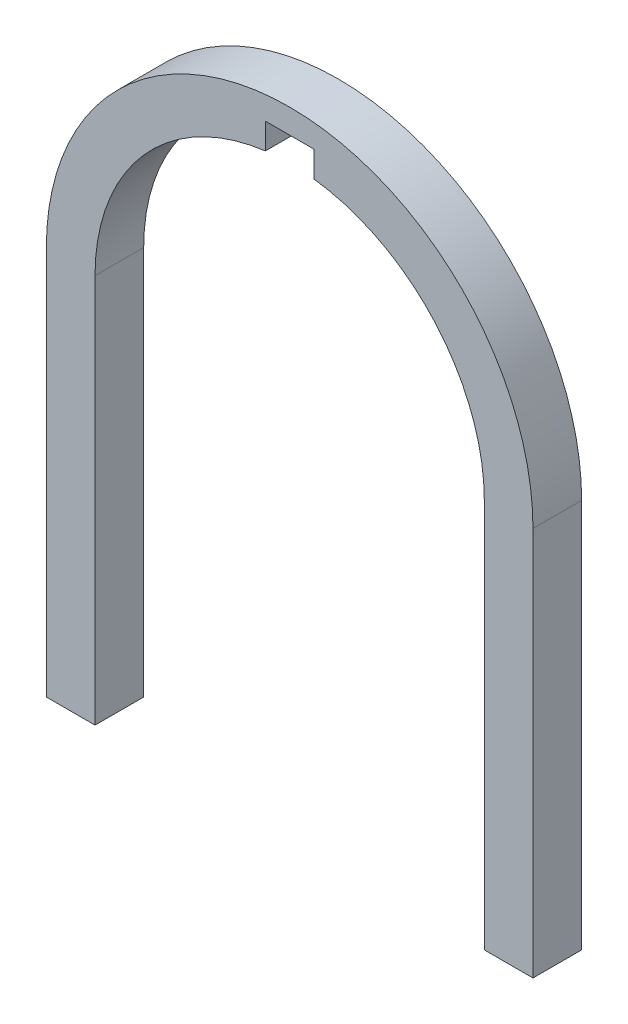
ISO-10303-21;
HEADER;
FILE_DESCRIPTION(('STEP AP214'),'2;1');
FILE_NAME('part.step','',(''),(''),'','','');
FILE_SCHEMA(('AUTOMOTIVE_DESIGN { 1 0 10303 214 1 1 1 1 }'));
ENDSEC;
DATA;
#1=APPLICATION_CONTEXT('core data for automotive mechanical design processes');
#2=APPLICATION_PROTOCOL_DEFINITION('international standard','automotive_design',2000,#1);
#3=PRODUCT_CONTEXT('',#1,'mechanical');
#4=PRODUCT('Part','Part','',(#3));
#5=PRODUCT_RELATED_PRODUCT_CATEGORY('part','',(#4));
#6=PRODUCT_DEFINITION_FORMATION('','',#4);
#7=PRODUCT_DEFINITION_CONTEXT('part definition',#1,'design');
#8=PRODUCT_DEFINITION('design','',#6,#7);
#9=PRODUCT_DEFINITION_SHAPE('','',#8);
#10=(LENGTH_UNIT() NAMED_UNIT(*) SI_UNIT(.MILLI.,.METRE.));
#11=(NAMED_UNIT(*) PLANE_ANGLE_UNIT() SI_UNIT($,.RADIAN.));
#12=(NAMED_UNIT(*) SI_UNIT($,.STERADIAN.) SOLID_ANGLE_UNIT());
#13=UNCERTAINTY_MEASURE_WITH_UNIT(LENGTH_MEASURE(1.E-05),#10,'distance_accuracy_value','');
#14=(GEOMETRIC_REPRESENTATION_CONTEXT(3) GLOBAL_UNCERTAINTY_ASSIGNED_CONTEXT((#13)) GLOBAL_UNIT_ASSIGNED_CONTEXT((#10,
#11,#12)) REPRESENTATION_CONTEXT('',''));
#15=CARTESIAN_POINT('',(0.,0.,0.));
#16=DIRECTION('',(0.,0.,1.));
#17=DIRECTION('',(1.,0.,0.));
#18=AXIS2_PLACEMENT_3D('',#15,#16,#17);
#19=CARTESIAN_POINT('',(-32.3663982008304,3.9707067424354,-4.65402003222828));
#20=DIRECTION('',(0.,0.,-1.));
#21=DIRECTION('',(-1.,0.,0.));
#22=AXIS2_PLACEMENT_3D('',#19,#20,#21);
#23=CYLINDRICAL_SURFACE('',#22,20.);
#24=CARTESIAN_POINT('',(-32.3663982008304,3.9707067424354,-9.65402003222828));
#25=DIRECTION('',(0.,0.,-1.));
#26=DIRECTION('',(-1.,0.,0.));
#27=AXIS2_PLACEMENT_3D('',#24,#25,#26);
#28=CIRCLE('',#27,20.);
#29=CARTESIAN_POINT('',(-52.3663982008304,3.9707067424354,-9.65402003222828));
#30=VERTEX_POINT('',#29);
#31=CARTESIAN_POINT('',(-34.8663982008304,23.8138415754198,-9.65402003222828));
#32=VERTEX_POINT('',#31);
#33=EDGE_CURVE('E149',#30,#32,#28,.T.);
#34=ORIENTED_EDGE('',*,*,#33,.T.);
#35=DIRECTION('',(0.,0.,-1.));
#36=VECTOR('',#35,1.);
#37=CARTESIAN_POINT('',(-34.8663982008304,23.8138415754198,-4.65402003222828));
#38=LINE('',#37,#36);
#39=CARTESIAN_POINT('',(-34.8663982008304,23.8138415754198,-4.65402003222828));
#40=VERTEX_POINT('',#39);
#41=EDGE_CURVE('E146',#32,#40,#38,.F.);
#42=ORIENTED_EDGE('',*,*,#41,.T.);
#43=CARTESIAN_POINT('',(-32.3663982008304,3.9707067424354,-4.65402003222828));
#44=DIRECTION('',(0.,0.,-1.));
#45=DIRECTION('',(-1.,0.,0.));
#46=AXIS2_PLACEMENT_3D('',#43,#44,#45);
#47=CIRCLE('',#46,20.);
#48=CARTESIAN_POINT('',(-52.3663982008304,3.9707067424354,-4.65402003222828));
#49=VERTEX_POINT('',#48);
#50=EDGE_CURVE('E230',#49,#40,#47,.T.);
#51=ORIENTED_EDGE('',*,*,#50,.F.);
#52=DIRECTION('',(0.,0.,-1.));
#53=VECTOR('',#52,1.);
#54=CARTESIAN_POINT('',(-52.3663982008304,3.9707067424354,-4.65402003222828));
#55=LINE('',#54,#53);
#56=EDGE_CURVE('E170',#49,#30,#55,.T.);
#57=ORIENTED_EDGE('',*,*,#56,.T.);
#58=EDGE_LOOP('',(#34,#42,#51,#57));
#59=FACE_BOUND('',#58,.T.);
#60=ADVANCED_FACE('F32',(#59),#23,.F.);
#61=CARTESIAN_POINT('',(-52.3663982008304,-36.0292932575646,-4.65402003222828));
#62=DIRECTION('',(0.,1.,0.));
#63=DIRECTION('',(-1.,0.,0.));
#64=AXIS2_PLACEMENT_3D('',#61,#62,#63);
#65=PLANE('',#64);
#66=DIRECTION('',(1.,0.,0.));
#67=VECTOR('',#66,1.);
#68=CARTESIAN_POINT('',(-52.3663982008304,-36.0292932575646,-9.65402003222828));
#69=LINE('',#68,#67);
#70=CARTESIAN_POINT('',(-57.3663982008304,-36.0292932575646,-9.65402003222828));
#71=VERTEX_POINT('',#70);
#72=CARTESIAN_POINT('',(-52.3663982008304,-36.0292932575646,-9.65402003222828));
#73=VERTEX_POINT('',#72);
#74=EDGE_CURVE('E142',#71,#73,#69,.T.);
#75=ORIENTED_EDGE('',*,*,#74,.T.);
#76=DIRECTION('',(0.,0.,-1.));
#77=VECTOR('',#76,1.);
#78=CARTESIAN_POINT('',(-52.3663982008304,-36.0292932575646,-4.65402003222828));
#79=LINE('',#78,#77);
#80=CARTESIAN_POINT('',(-52.3663982008304,-36.0292932575646,-4.65402003222828));
#81=VERTEX_POINT('',#80);
#82=EDGE_CURVE('E40',#81,#73,#79,.T.);
#83=ORIENTED_EDGE('',*,*,#82,.F.);
#84=DIRECTION('',(1.,0.,0.));
#85=VECTOR('',#84,1.);
#86=CARTESIAN_POINT('',(-52.3663982008304,-36.0292932575646,-4.65402003222828));
#87=LINE('',#86,#85);
#88=CARTESIAN_POINT('',(-57.3663982008304,-36.0292932575646,-4.65402003222828));
#89=VERTEX_POINT('',#88);
#90=EDGE_CURVE('E160',#89,#81,#87,.T.);
#91=ORIENTED_EDGE('',*,*,#90,.F.);
#92=DIRECTION('',(0.,0.,-1.));
#93=VECTOR('',#92,1.);
#94=CARTESIAN_POINT('',(-57.3663982008304,-36.0292932575646,-4.65402003222828));
#95=LINE('',#94,#93);
#96=EDGE_CURVE('E138',#89,#71,#95,.T.);
#97=ORIENTED_EDGE('',*,*,#96,.T.);
#98=EDGE_LOOP('',(#75,#83,#91,#97));
#99=FACE_BOUND('',#98,.T.);
#100=ADVANCED_FACE('F34',(#99),#65,.F.);
#101=CARTESIAN_POINT('',(-52.3663982008304,-36.0292932575646,-4.65402003222828));
#102=DIRECTION('',(-1.,0.,0.));
#103=DIRECTION('',(0.,-1.,0.));
#104=AXIS2_PLACEMENT_3D('',#101,#102,#103);
#105=PLANE('',#104);
#106=DIRECTION('',(0.,1.,0.));
#107=VECTOR('',#106,1.);
#108=CARTESIAN_POINT('',(-52.3663982008304,-36.0292932575646,-9.65402003222828));
#109=LINE('',#108,#107);
#110=EDGE_CURVE('E145',#73,#30,#109,.T.);
#111=ORIENTED_EDGE('',*,*,#110,.T.);
#112=ORIENTED_EDGE('',*,*,#56,.F.);
#113=DIRECTION('',(0.,1.,0.));
#114=VECTOR('',#113,1.);
#115=CARTESIAN_POINT('',(-52.3663982008304,-36.0292932575646,-4.65402003222828));
#116=LINE('',#115,#114);
#117=EDGE_CURVE('E98',#81,#49,#116,.T.);
#118=ORIENTED_EDGE('',*,*,#117,.F.);
#119=ORIENTED_EDGE('',*,*,#82,.T.);
#120=EDGE_LOOP('',(#111,#112,#118,#119));
#121=FACE_BOUND('',#120,.T.);
#122=ADVANCED_FACE('F173',(#121),#105,.F.);
#123=CARTESIAN_POINT('',(-29.8663982008304,23.8138415754198,-4.65402003222828));
#124=VERTEX_POINT('',#123);
#125=CARTESIAN_POINT('',(-12.3663982008304,3.9707067424354,-4.65402003222828));
#126=VERTEX_POINT('',#125);
#127=EDGE_CURVE('E229',#124,#126,#47,.T.);
#128=ORIENTED_EDGE('',*,*,#127,.F.);
#129=DIRECTION('',(0.,0.,-1.));
#130=VECTOR('',#129,1.);
#131=CARTESIAN_POINT('',(-29.8663982008304,23.8138415754198,-4.65402003222828));
#132=LINE('',#131,#130);
#133=CARTESIAN_POINT('',(-29.8663982008304,23.8138415754198,-9.65402003222828));
#134=VERTEX_POINT('',#133);
#135=EDGE_CURVE('E211',#124,#134,#132,.T.);
#136=ORIENTED_EDGE('',*,*,#135,.T.);
#137=CARTESIAN_POINT('',(-12.3663982008304,3.9707067424354,-9.65402003222828));
#138=VERTEX_POINT('',#137);
#139=EDGE_CURVE('E148',#134,#138,#28,.T.);
#140=ORIENTED_EDGE('',*,*,#139,.T.);
#141=DIRECTION('',(0.,0.,-1.));
#142=VECTOR('',#141,1.);
#143=CARTESIAN_POINT('',(-12.3663982008304,3.9707067424354,-4.65402003222828));
#144=LINE('',#143,#142);
#145=EDGE_CURVE('E167',#126,#138,#144,.T.);
#146=ORIENTED_EDGE('',*,*,#145,.F.);
#147=EDGE_LOOP('',(#128,#136,#140,#146));
#148=FACE_BOUND('',#147,.T.);
#149=ADVANCED_FACE('F247',(#148),#23,.F.);
#150=CARTESIAN_POINT('',(-12.3663982008304,3.9707067424354,-4.65402003222828));
#151=DIRECTION('',(1.,0.,0.));
#152=DIRECTION('',(0.,1.,0.));
#153=AXIS2_PLACEMENT_3D('',#150,#151,#152);
#154=PLANE('',#153);
#155=DIRECTION('',(0.,-1.,0.));
#156=VECTOR('',#155,1.);
#157=CARTESIAN_POINT('',(-12.3663982008304,3.9707067424354,-9.65402003222828));
#158=LINE('',#157,#156);
#159=CARTESIAN_POINT('',(-12.3663982008304,-36.0292932575646,-9.65402003222828));
#160=VERTEX_POINT('',#159);
#161=EDGE_CURVE('E152',#138,#160,#158,.T.);
#162=ORIENTED_EDGE('',*,*,#161,.T.);
#163=DIRECTION('',(0.,0.,-1.));
#164=VECTOR('',#163,1.);
#165=CARTESIAN_POINT('',(-12.3663982008304,-36.0292932575646,-4.65402003222828));
#166=LINE('',#165,#164);
#167=CARTESIAN_POINT('',(-12.3663982008304,-36.0292932575646,-4.65402003222828));
#168=VERTEX_POINT('',#167);
#169=EDGE_CURVE('E164',#168,#160,#166,.T.);
#170=ORIENTED_EDGE('',*,*,#169,.F.);
#171=DIRECTION('',(0.,-1.,0.));
#172=VECTOR('',#171,1.);
#173=CARTESIAN_POINT('',(-12.3663982008304,3.9707067424354,-4.65402003222828));
#174=LINE('',#173,#172);
#175=EDGE_CURVE('E232',#126,#168,#174,.T.);
#176=ORIENTED_EDGE('',*,*,#175,.F.);
#177=ORIENTED_EDGE('',*,*,#145,.T.);
#178=EDGE_LOOP('',(#162,#170,#176,#177));
#179=FACE_BOUND('',#178,.T.);
#180=ADVANCED_FACE('F239',(#179),#154,.F.);
#181=CARTESIAN_POINT('',(-12.3663982008304,-36.0292932575646,-4.65402003222828));
#182=DIRECTION('',(0.,1.,0.));
#183=DIRECTION('',(-1.,0.,0.));
#184=AXIS2_PLACEMENT_3D('',#181,#182,#183);
#185=PLANE('',#184);
#186=DIRECTION('',(1.,0.,0.));
#187=VECTOR('',#186,1.);
#188=CARTESIAN_POINT('',(-12.3663982008304,-36.0292932575646,-9.65402003222828));
#189=LINE('',#188,#187);
#190=CARTESIAN_POINT('',(-7.36639820083039,-36.0292932575646,-9.65402003222828));
#191=VERTEX_POINT('',#190);
#192=EDGE_CURVE('E154',#160,#191,#189,.T.);
#193=ORIENTED_EDGE('',*,*,#192,.T.);
#194=DIRECTION('',(0.,0.,-1.));
#195=VECTOR('',#194,1.);
#196=CARTESIAN_POINT('',(-7.36639820083039,-36.0292932575646,-4.65402003222828));
#197=LINE('',#196,#195);
#198=CARTESIAN_POINT('',(-7.36639820083039,-36.0292932575646,-4.65402003222828));
#199=VERTEX_POINT('',#198);
#200=EDGE_CURVE('E133',#199,#191,#197,.T.);
#201=ORIENTED_EDGE('',*,*,#200,.F.);
#202=DIRECTION('',(1.,0.,0.));
#203=VECTOR('',#202,1.);
#204=CARTESIAN_POINT('',(-12.3663982008304,-36.0292932575646,-4.65402003222828));
#205=LINE('',#204,#203);
#206=EDGE_CURVE('E121',#168,#199,#205,.T.);
#207=ORIENTED_EDGE('',*,*,#206,.F.);
#208=ORIENTED_EDGE('',*,*,#169,.T.);
#209=EDGE_LOOP('',(#193,#201,#207,#208));
#210=FACE_BOUND('',#209,.T.);
#211=ADVANCED_FACE('F243',(#210),#185,.F.);
#212=CARTESIAN_POINT('',(-7.36639820083039,-36.0292932575646,-4.65402003222828));
#213=DIRECTION('',(-1.,0.,0.));
#214=DIRECTION('',(0.,0.,1.));
#215=AXIS2_PLACEMENT_3D('',#212,#213,#214);
#216=PLANE('',#215);
#217=DIRECTION('',(0.,1.,0.));
#218=VECTOR('',#217,1.);
#219=CARTESIAN_POINT('',(-7.36639820083039,-36.0292932575646,-9.65402003222828));
#220=LINE('',#219,#218);
#221=CARTESIAN_POINT('',(-7.36639820083039,3.9707067424354,-9.65402003222828));
#222=VERTEX_POINT('',#221);
#223=EDGE_CURVE('E130',#191,#222,#220,.T.);
#224=ORIENTED_EDGE('',*,*,#223,.T.);
#225=DIRECTION('',(0.,0.,-1.));
#226=VECTOR('',#225,1.);
#227=CARTESIAN_POINT('',(-7.36639820083039,3.9707067424354,-4.65402003222828));
#228=LINE('',#227,#226);
#229=CARTESIAN_POINT('',(-7.36639820083039,3.9707067424354,-4.65402003222828));
#230=VERTEX_POINT('',#229);
#231=EDGE_CURVE('E127',#230,#222,#228,.T.);
#232=ORIENTED_EDGE('',*,*,#231,.F.);
#233=DIRECTION('',(0.,1.,0.));
#234=VECTOR('',#233,1.);
#235=CARTESIAN_POINT('',(-7.36639820083039,-36.0292932575646,-4.65402003222828));
#236=LINE('',#235,#234);
#237=EDGE_CURVE('E113',#199,#230,#236,.T.);
#238=ORIENTED_EDGE('',*,*,#237,.F.);
#239=ORIENTED_EDGE('',*,*,#200,.T.);
#240=EDGE_LOOP('',(#224,#232,#238,#239));
#241=FACE_BOUND('',#240,.T.);
#242=ADVANCED_FACE('F128',(#241),#216,.F.);
#243=CARTESIAN_POINT('',(-32.3663982008304,3.9707067424354,-4.65402003222828));
#244=DIRECTION('',(0.,0.,-1.));
#245=DIRECTION('',(-1.,0.,0.));
#246=AXIS2_PLACEMENT_3D('',#243,#244,#245);
#247=CYLINDRICAL_SURFACE('',#246,25.);
#248=CARTESIAN_POINT('',(-32.3663982008304,3.9707067424354,-9.65402003222828));
#249=DIRECTION('',(0.,0.,1.));
#250=DIRECTION('',(1.,0.,0.));
#251=AXIS2_PLACEMENT_3D('',#248,#249,#250);
#252=CIRCLE('',#251,25.);
#253=CARTESIAN_POINT('',(-57.3663982008304,3.9707067424354,-9.65402003222828));
#254=VERTEX_POINT('',#253);
#255=EDGE_CURVE('E157',#222,#254,#252,.T.);
#256=ORIENTED_EDGE('',*,*,#255,.T.);
#257=DIRECTION('',(0.,0.,-1.));
#258=VECTOR('',#257,1.);
#259=CARTESIAN_POINT('',(-57.3663982008304,3.9707067424354,-4.65402003222828));
#260=LINE('',#259,#258);
#261=CARTESIAN_POINT('',(-57.3663982008304,3.9707067424354,-4.65402003222828));
#262=VERTEX_POINT('',#261);
#263=EDGE_CURVE('E134',#262,#254,#260,.T.);
#264=ORIENTED_EDGE('',*,*,#263,.F.);
#265=CARTESIAN_POINT('',(-32.3663982008304,3.9707067424354,-4.65402003222828));
#266=DIRECTION('',(0.,0.,1.));
#267=DIRECTION('',(1.,0.,0.));
#268=AXIS2_PLACEMENT_3D('',#265,#266,#267);
#269=CIRCLE('',#268,25.);
#270=EDGE_CURVE('E118',#230,#262,#269,.T.);
#271=ORIENTED_EDGE('',*,*,#270,.F.);
#272=ORIENTED_EDGE('',*,*,#231,.T.);
#273=EDGE_LOOP('',(#256,#264,#271,#272));
#274=FACE_BOUND('',#273,.T.);
#275=ADVANCED_FACE('F136',(#274),#247,.T.);
#276=CARTESIAN_POINT('',(-57.3663982008304,-36.0292932575646,-4.65402003222828));
#277=DIRECTION('',(1.,0.,0.));
#278=DIRECTION('',(0.,0.,-1.));
#279=AXIS2_PLACEMENT_3D('',#276,#277,#278);
#280=PLANE('',#279);
#281=DIRECTION('',(0.,-1.,0.));
#282=VECTOR('',#281,1.);
#283=CARTESIAN_POINT('',(-57.3663982008304,-36.0292932575646,-9.65402003222828));
#284=LINE('',#283,#282);
#285=EDGE_CURVE('E89',#254,#71,#284,.T.);
#286=ORIENTED_EDGE('',*,*,#285,.T.);
#287=ORIENTED_EDGE('',*,*,#96,.F.);
#288=DIRECTION('',(0.,-1.,0.));
#289=VECTOR('',#288,1.);
#290=CARTESIAN_POINT('',(-57.3663982008304,-36.0292932575646,-4.65402003222828));
#291=LINE('',#290,#289);
#292=EDGE_CURVE('E56',#262,#89,#291,.T.);
#293=ORIENTED_EDGE('',*,*,#292,.F.);
#294=ORIENTED_EDGE('',*,*,#263,.T.);
#295=EDGE_LOOP('',(#286,#287,#293,#294));
#296=FACE_BOUND('',#295,.T.);
#297=ADVANCED_FACE('F244',(#296),#280,.F.);
#298=CARTESIAN_POINT('',(-32.3663982008304,3.9707067424354,-4.65402003222828));
#299=DIRECTION('',(0.,0.,1.));
#300=DIRECTION('',(1.,0.,0.));
#301=AXIS2_PLACEMENT_3D('',#298,#299,#300);
#302=PLANE('',#301);
#303=DIRECTION('',(0.,-1.,0.));
#304=VECTOR('',#303,1.);
#305=CARTESIAN_POINT('',(-34.8663982008304,-38.5777328131163,-4.65402003222828));
#306=LINE('',#305,#304);
#307=CARTESIAN_POINT('',(-34.8663982008304,26.4707067424354,-4.65402003222828));
#308=VERTEX_POINT('',#307);
#309=EDGE_CURVE('E193',#308,#40,#306,.T.);
#310=ORIENTED_EDGE('',*,*,#309,.F.);
#311=DIRECTION('',(-1.,0.,0.));
#312=VECTOR('',#311,1.);
#313=CARTESIAN_POINT('',(-34.8663982008304,26.4707067424354,-4.65402003222828));
#314=LINE('',#313,#312);
#315=CARTESIAN_POINT('',(-29.8663982008304,26.4707067424354,-4.65402003222828));
#316=VERTEX_POINT('',#315);
#317=EDGE_CURVE('E210',#316,#308,#314,.T.);
#318=ORIENTED_EDGE('',*,*,#317,.F.);
#319=DIRECTION('',(0.,1.,0.));
#320=VECTOR('',#319,1.);
#321=CARTESIAN_POINT('',(-29.8663982008304,-38.5777328131163,-4.65402003222828));
#322=LINE('',#321,#320);
#323=EDGE_CURVE('E221',#124,#316,#322,.T.);
#324=ORIENTED_EDGE('',*,*,#323,.F.);
#325=ORIENTED_EDGE('',*,*,#127,.T.);
#326=ORIENTED_EDGE('',*,*,#175,.T.);
#327=ORIENTED_EDGE('',*,*,#206,.T.);
#328=ORIENTED_EDGE('',*,*,#237,.T.);
#329=ORIENTED_EDGE('',*,*,#270,.T.);
#330=ORIENTED_EDGE('',*,*,#292,.T.);
#331=ORIENTED_EDGE('',*,*,#90,.T.);
#332=ORIENTED_EDGE('',*,*,#117,.T.);
#333=ORIENTED_EDGE('',*,*,#50,.T.);
#334=EDGE_LOOP('',(#310,#318,#324,#325,#326,#327,#328,#329,#330,#331,#332,#333));
#335=FACE_BOUND('',#334,.T.);
#336=ADVANCED_FACE('F116',(#335),#302,.T.);
#337=CARTESIAN_POINT('',(-32.3663982008304,3.9707067424354,-9.65402003222828));
#338=DIRECTION('',(0.,0.,1.));
#339=DIRECTION('',(1.,0.,0.));
#340=AXIS2_PLACEMENT_3D('',#337,#338,#339);
#341=PLANE('',#340);
#342=DIRECTION('',(-1.,0.,0.));
#343=VECTOR('',#342,1.);
#344=CARTESIAN_POINT('',(-34.8663982008304,26.4707067424354,-9.65402003222828));
#345=LINE('',#344,#343);
#346=CARTESIAN_POINT('',(-29.8663982008304,26.4707067424354,-9.65402003222828));
#347=VERTEX_POINT('',#346);
#348=CARTESIAN_POINT('',(-34.8663982008304,26.4707067424354,-9.65402003222828));
#349=VERTEX_POINT('',#348);
#350=EDGE_CURVE('E47',#347,#349,#345,.T.);
#351=ORIENTED_EDGE('',*,*,#350,.T.);
#352=DIRECTION('',(0.,-1.,0.));
#353=VECTOR('',#352,1.);
#354=CARTESIAN_POINT('',(-34.8663982008304,-38.5777328131163,-9.65402003222828));
#355=LINE('',#354,#353);
#356=EDGE_CURVE('E182',#349,#32,#355,.T.);
#357=ORIENTED_EDGE('',*,*,#356,.T.);
#358=ORIENTED_EDGE('',*,*,#33,.F.);
#359=ORIENTED_EDGE('',*,*,#110,.F.);
#360=ORIENTED_EDGE('',*,*,#74,.F.);
#361=ORIENTED_EDGE('',*,*,#285,.F.);
#362=ORIENTED_EDGE('',*,*,#255,.F.);
#363=ORIENTED_EDGE('',*,*,#223,.F.);
#364=ORIENTED_EDGE('',*,*,#192,.F.);
#365=ORIENTED_EDGE('',*,*,#161,.F.);
#366=ORIENTED_EDGE('',*,*,#139,.F.);
#367=DIRECTION('',(0.,1.,0.));
#368=VECTOR('',#367,1.);
#369=CARTESIAN_POINT('',(-29.8663982008304,3.9707067424354,-9.65402003222828));
#370=LINE('',#369,#368);
#371=EDGE_CURVE('E11',#134,#347,#370,.T.);
#372=ORIENTED_EDGE('',*,*,#371,.T.);
#373=EDGE_LOOP('',(#351,#357,#358,#359,#360,#361,#362,#363,#364,#365,#366,#372));
#374=FACE_BOUND('',#373,.T.);
#375=ADVANCED_FACE('F178',(#374),#341,.F.);
#376=CARTESIAN_POINT('',(-34.8663982008304,-38.5777328131163,-9.65402003222828));
#377=DIRECTION('',(-1.,0.,0.));
#378=DIRECTION('',(0.,-1.,0.));
#379=AXIS2_PLACEMENT_3D('',#376,#377,#378);
#380=PLANE('',#379);
#381=ORIENTED_EDGE('',*,*,#356,.F.);
#382=DIRECTION('',(0.,0.,1.));
#383=VECTOR('',#382,1.);
#384=CARTESIAN_POINT('',(-34.8663982008304,26.4707067424354,-9.65402003222828));
#385=LINE('',#384,#383);
#386=EDGE_CURVE('E207',#349,#308,#385,.T.);
#387=ORIENTED_EDGE('',*,*,#386,.T.);
#388=ORIENTED_EDGE('',*,*,#309,.T.);
#389=ORIENTED_EDGE('',*,*,#41,.F.);
#390=EDGE_LOOP('',(#381,#387,#388,#389));
#391=FACE_BOUND('',#390,.T.);
#392=ADVANCED_FACE('F214',(#391),#380,.F.);
#393=CARTESIAN_POINT('',(-29.8663982008304,-38.5777328131163,-9.65402003222828));
#394=DIRECTION('',(1.,0.,0.));
#395=DIRECTION('',(0.,0.,-1.));
#396=AXIS2_PLACEMENT_3D('',#393,#394,#395);
#397=PLANE('',#396);
#398=ORIENTED_EDGE('',*,*,#323,.T.);
#399=DIRECTION('',(0.,0.,1.));
#400=VECTOR('',#399,1.);
#401=CARTESIAN_POINT('',(-29.8663982008304,26.4707067424354,-9.65402003222828));
#402=LINE('',#401,#400);
#403=EDGE_CURVE('E212',#347,#316,#402,.T.);
#404=ORIENTED_EDGE('',*,*,#403,.F.);
#405=ORIENTED_EDGE('',*,*,#371,.F.);
#406=ORIENTED_EDGE('',*,*,#135,.F.);
#407=EDGE_LOOP('',(#398,#404,#405,#406));
#408=FACE_BOUND('',#407,.T.);
#409=ADVANCED_FACE('F248',(#408),#397,.F.);
#410=CARTESIAN_POINT('',(-34.8663982008304,26.4707067424354,-9.65402003222828));
#411=DIRECTION('',(0.,1.,0.));
#412=DIRECTION('',(0.,0.,1.));
#413=AXIS2_PLACEMENT_3D('',#410,#411,#412);
#414=PLANE('',#413);
#415=ORIENTED_EDGE('',*,*,#317,.T.);
#416=ORIENTED_EDGE('',*,*,#386,.F.);
#417=ORIENTED_EDGE('',*,*,#350,.F.);
#418=ORIENTED_EDGE('',*,*,#403,.T.);
#419=EDGE_LOOP('',(#415,#416,#417,#418));
#420=FACE_BOUND('',#419,.T.);
#421=ADVANCED_FACE('F208',(#420),#414,.F.);
#422=CLOSED_SHELL('',(#60,#100,#122,#149,#180,#211,#242,#275,#297,#336,#375,#392,#409,#421));
#423=MANIFOLD_SOLID_BREP('B2',#422);
#424=ADVANCED_BREP_SHAPE_REPRESENTATION('',(#18,#423),#14);
#425=SHAPE_DEFINITION_REPRESENTATION(#9,#424);
ENDSEC;
END-ISO-10303-21;
